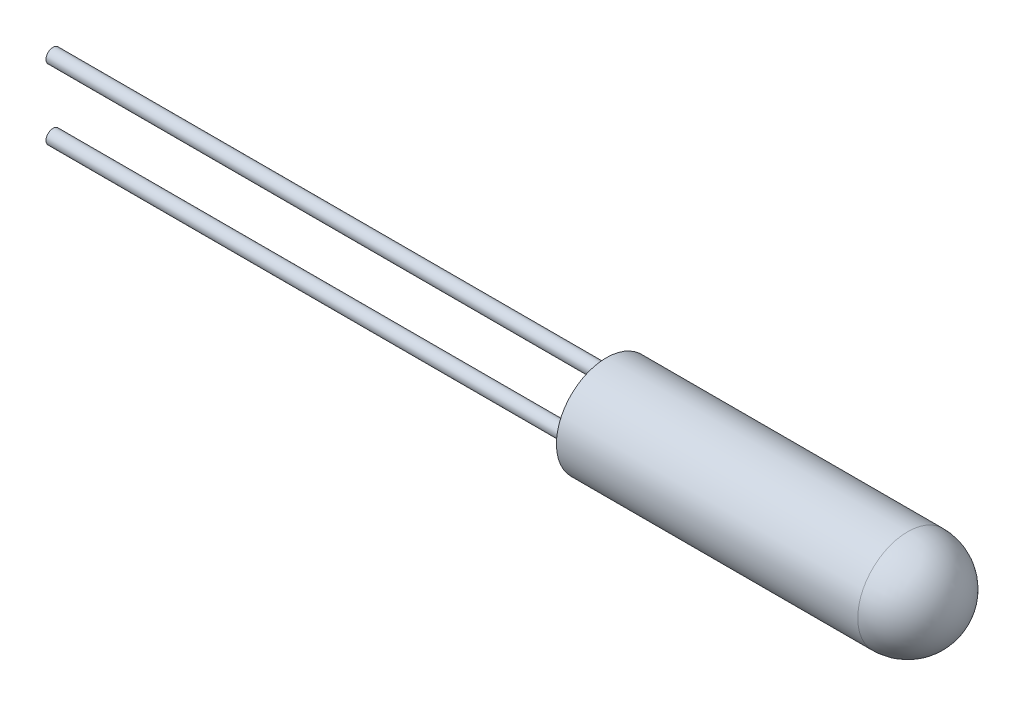
ISO-10303-21;
HEADER;
FILE_DESCRIPTION(('STEP AP214'),'2;1');
FILE_NAME('part.step','',(''),(''),'','','');
FILE_SCHEMA(('AUTOMOTIVE_DESIGN { 1 0 10303 214 1 1 1 1 }'));
ENDSEC;
DATA;
#1=APPLICATION_CONTEXT('core data for automotive mechanical design processes');
#2=APPLICATION_PROTOCOL_DEFINITION('international standard','automotive_design',2000,#1);
#3=PRODUCT_CONTEXT('',#1,'mechanical');
#4=PRODUCT('Part','Part','',(#3));
#5=PRODUCT_RELATED_PRODUCT_CATEGORY('part','',(#4));
#6=PRODUCT_DEFINITION_FORMATION('','',#4);
#7=PRODUCT_DEFINITION_CONTEXT('part definition',#1,'design');
#8=PRODUCT_DEFINITION('design','',#6,#7);
#9=PRODUCT_DEFINITION_SHAPE('','',#8);
#10=(LENGTH_UNIT() NAMED_UNIT(*) SI_UNIT(.MILLI.,.METRE.));
#11=(NAMED_UNIT(*) PLANE_ANGLE_UNIT() SI_UNIT($,.RADIAN.));
#12=(NAMED_UNIT(*) SI_UNIT($,.STERADIAN.) SOLID_ANGLE_UNIT());
#13=UNCERTAINTY_MEASURE_WITH_UNIT(LENGTH_MEASURE(1.E-05),#10,'distance_accuracy_value','');
#14=(GEOMETRIC_REPRESENTATION_CONTEXT(3) GLOBAL_UNCERTAINTY_ASSIGNED_CONTEXT((#13)) GLOBAL_UNIT_ASSIGNED_CONTEXT((#10,
#11,#12)) REPRESENTATION_CONTEXT('',''));
#15=CARTESIAN_POINT('',(0.,0.,0.));
#16=DIRECTION('',(0.,0.,1.));
#17=DIRECTION('',(1.,0.,0.));
#18=AXIS2_PLACEMENT_3D('',#15,#16,#17);
#19=CARTESIAN_POINT('',(0.,0.,0.));
#20=DIRECTION('',(-1.,0.,0.));
#21=DIRECTION('',(0.,-1.,0.));
#22=AXIS2_PLACEMENT_3D('',#19,#20,#21);
#23=PLANE('',#22);
#24=CARTESIAN_POINT('',(0.,-0.635,0.));
#25=DIRECTION('',(-1.,0.,0.));
#26=DIRECTION('',(0.,-1.,0.));
#27=AXIS2_PLACEMENT_3D('',#24,#25,#26);
#28=CIRCLE('',#27,0.127);
#29=CARTESIAN_POINT('',(0.,-0.762,0.));
#30=VERTEX_POINT('',#29);
#31=EDGE_CURVE('E38',#30,#30,#28,.T.);
#32=ORIENTED_EDGE('',*,*,#31,.F.);
#33=EDGE_LOOP('',(#32));
#34=FACE_BOUND('',#33,.T.);
#35=CARTESIAN_POINT('',(0.,0.635,0.));
#36=DIRECTION('',(-1.,0.,0.));
#37=DIRECTION('',(0.,-1.,0.));
#38=AXIS2_PLACEMENT_3D('',#35,#36,#37);
#39=CIRCLE('',#38,0.127);
#40=CARTESIAN_POINT('',(0.,0.508,0.));
#41=VERTEX_POINT('',#40);
#42=EDGE_CURVE('E32',#41,#41,#39,.T.);
#43=ORIENTED_EDGE('',*,*,#42,.F.);
#44=EDGE_LOOP('',(#43));
#45=FACE_BOUND('',#44,.T.);
#46=CARTESIAN_POINT('',(0.,0.,0.));
#47=DIRECTION('',(1.,0.,0.));
#48=DIRECTION('',(0.,1.,0.));
#49=AXIS2_PLACEMENT_3D('',#46,#47,#48);
#50=CIRCLE('',#49,0.9017);
#51=CARTESIAN_POINT('',(0.,0.9017,0.));
#52=VERTEX_POINT('',#51);
#53=EDGE_CURVE('E10',#52,#52,#50,.T.);
#54=ORIENTED_EDGE('',*,*,#53,.F.);
#55=EDGE_LOOP('',(#54));
#56=FACE_BOUND('',#55,.T.);
#57=ADVANCED_FACE('F15',(#34,#45,#56),#23,.T.);
#58=CARTESIAN_POINT('',(6.35,0.,0.));
#59=DIRECTION('',(1.,0.,0.));
#60=DIRECTION('',(0.,1.,0.));
#61=AXIS2_PLACEMENT_3D('',#58,#59,#60);
#62=CYLINDRICAL_SURFACE('',#61,0.9017);
#63=ORIENTED_EDGE('',*,*,#53,.T.);
#64=EDGE_LOOP('',(#63));
#65=FACE_BOUND('',#64,.T.);
#66=CARTESIAN_POINT('',(5.45084,0.,0.));
#67=DIRECTION('',(1.,0.,0.));
#68=DIRECTION('',(0.,1.,0.));
#69=AXIS2_PLACEMENT_3D('',#66,#67,#68);
#70=CIRCLE('',#69,0.9017);
#71=CARTESIAN_POINT('',(5.45084,0.9017,0.));
#72=VERTEX_POINT('',#71);
#73=EDGE_CURVE('E21',#72,#72,#70,.T.);
#74=ORIENTED_EDGE('',*,*,#73,.F.);
#75=EDGE_LOOP('',(#74));
#76=FACE_BOUND('',#75,.T.);
#77=ADVANCED_FACE('F55',(#65,#76),#62,.T.);
#78=CARTESIAN_POINT('',(5.45084,0.,0.));
#79=DIRECTION('',(1.,0.,0.));
#80=DIRECTION('',(0.,1.,0.));
#81=AXIS2_PLACEMENT_3D('',#78,#79,#80);
#82=DEGENERATE_TOROIDAL_SURFACE('',#81,0.00253999999999909,0.89916,.T.);
#83=ORIENTED_EDGE('',*,*,#73,.T.);
#84=EDGE_LOOP('',(#83));
#85=FACE_BOUND('',#84,.T.);
#86=CARTESIAN_POINT('',(6.35,0.,0.));
#87=DIRECTION('',(1.,0.,0.));
#88=DIRECTION('',(0.,1.,0.));
#89=AXIS2_PLACEMENT_3D('',#86,#87,#88);
#90=CIRCLE('',#89,0.00253999999999917);
#91=CARTESIAN_POINT('',(6.35,0.00253999999999934,0.));
#92=VERTEX_POINT('',#91);
#93=EDGE_CURVE('E25',#92,#92,#90,.T.);
#94=ORIENTED_EDGE('',*,*,#93,.F.);
#95=EDGE_LOOP('',(#94));
#96=FACE_BOUND('',#95,.T.);
#97=ADVANCED_FACE('F72',(#85,#96),#82,.T.);
#98=CARTESIAN_POINT('',(6.35,0.00253999999999933,0.));
#99=DIRECTION('',(1.,0.,0.));
#100=DIRECTION('',(0.,1.,0.));
#101=AXIS2_PLACEMENT_3D('',#98,#99,#100);
#102=PLANE('',#101);
#103=ORIENTED_EDGE('',*,*,#93,.T.);
#104=EDGE_LOOP('',(#103));
#105=FACE_BOUND('',#104,.T.);
#106=ADVANCED_FACE('F61',(#105),#102,.T.);
#107=CARTESIAN_POINT('',(-10.0076,0.635000000000012,0.));
#108=DIRECTION('',(1.,0.,0.));
#109=DIRECTION('',(0.,1.,0.));
#110=AXIS2_PLACEMENT_3D('',#107,#108,#109);
#111=CYLINDRICAL_SURFACE('',#110,0.127);
#112=CARTESIAN_POINT('',(-10.0076,0.635000000000012,0.));
#113=DIRECTION('',(-1.,0.,0.));
#114=DIRECTION('',(0.,-1.,0.));
#115=AXIS2_PLACEMENT_3D('',#112,#113,#114);
#116=CIRCLE('',#115,0.127);
#117=CARTESIAN_POINT('',(-10.0076,0.508000000000012,0.));
#118=VERTEX_POINT('',#117);
#119=EDGE_CURVE('E29',#118,#118,#116,.T.);
#120=ORIENTED_EDGE('',*,*,#119,.F.);
#121=EDGE_LOOP('',(#120));
#122=FACE_BOUND('',#121,.T.);
#123=ORIENTED_EDGE('',*,*,#42,.T.);
#124=EDGE_LOOP('',(#123));
#125=FACE_BOUND('',#124,.T.);
#126=ADVANCED_FACE('F59',(#122,#125),#111,.T.);
#127=CARTESIAN_POINT('',(-10.0076,0.635000000000012,0.));
#128=DIRECTION('',(-1.,0.,0.));
#129=DIRECTION('',(0.,-1.,0.));
#130=AXIS2_PLACEMENT_3D('',#127,#128,#129);
#131=PLANE('',#130);
#132=ORIENTED_EDGE('',*,*,#119,.T.);
#133=EDGE_LOOP('',(#132));
#134=FACE_BOUND('',#133,.T.);
#135=ADVANCED_FACE('F49',(#134),#131,.T.);
#136=CARTESIAN_POINT('',(-10.0076,-0.634999999999988,0.));
#137=DIRECTION('',(1.,0.,0.));
#138=DIRECTION('',(0.,1.,0.));
#139=AXIS2_PLACEMENT_3D('',#136,#137,#138);
#140=CYLINDRICAL_SURFACE('',#139,0.127);
#141=CARTESIAN_POINT('',(-10.0076,-0.634999999999988,0.));
#142=DIRECTION('',(-1.,0.,0.));
#143=DIRECTION('',(0.,-1.,0.));
#144=AXIS2_PLACEMENT_3D('',#141,#142,#143);
#145=CIRCLE('',#144,0.127);
#146=CARTESIAN_POINT('',(-10.0076,-0.761999999999988,0.));
#147=VERTEX_POINT('',#146);
#148=EDGE_CURVE('E35',#147,#147,#145,.T.);
#149=ORIENTED_EDGE('',*,*,#148,.F.);
#150=EDGE_LOOP('',(#149));
#151=FACE_BOUND('',#150,.T.);
#152=ORIENTED_EDGE('',*,*,#31,.T.);
#153=EDGE_LOOP('',(#152));
#154=FACE_BOUND('',#153,.T.);
#155=ADVANCED_FACE('F46',(#151,#154),#140,.T.);
#156=CARTESIAN_POINT('',(-10.0076,-0.634999999999988,0.));
#157=DIRECTION('',(-1.,0.,0.));
#158=DIRECTION('',(0.,-1.,0.));
#159=AXIS2_PLACEMENT_3D('',#156,#157,#158);
#160=PLANE('',#159);
#161=ORIENTED_EDGE('',*,*,#148,.T.);
#162=EDGE_LOOP('',(#161));
#163=FACE_BOUND('',#162,.T.);
#164=ADVANCED_FACE('F44',(#163),#160,.T.);
#165=CLOSED_SHELL('',(#57,#77,#97,#106,#126,#135,#155,#164));
#166=MANIFOLD_SOLID_BREP('B1',#165);
#167=ADVANCED_BREP_SHAPE_REPRESENTATION('',(#18,#166),#14);
#168=SHAPE_DEFINITION_REPRESENTATION(#9,#167);
ENDSEC;
END-ISO-10303-21;
